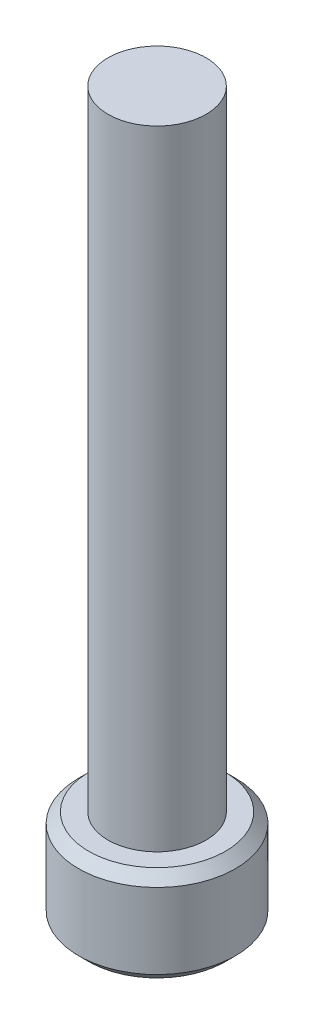
ISO-10303-21;
HEADER;
FILE_DESCRIPTION(('STEP AP214'),'2;1');
FILE_NAME('part.step','',(''),(''),'','','');
FILE_SCHEMA(('AUTOMOTIVE_DESIGN { 1 0 10303 214 1 1 1 1 }'));
ENDSEC;
DATA;
#1=APPLICATION_CONTEXT('core data for automotive mechanical design processes');
#2=APPLICATION_PROTOCOL_DEFINITION('international standard','automotive_design',2000,#1);
#3=PRODUCT_CONTEXT('',#1,'mechanical');
#4=PRODUCT('Part','Part','',(#3));
#5=PRODUCT_RELATED_PRODUCT_CATEGORY('part','',(#4));
#6=PRODUCT_DEFINITION_FORMATION('','',#4);
#7=PRODUCT_DEFINITION_CONTEXT('part definition',#1,'design');
#8=PRODUCT_DEFINITION('design','',#6,#7);
#9=PRODUCT_DEFINITION_SHAPE('','',#8);
#10=(LENGTH_UNIT() NAMED_UNIT(*) SI_UNIT(.MILLI.,.METRE.));
#11=(NAMED_UNIT(*) PLANE_ANGLE_UNIT() SI_UNIT($,.RADIAN.));
#12=(NAMED_UNIT(*) SI_UNIT($,.STERADIAN.) SOLID_ANGLE_UNIT());
#13=UNCERTAINTY_MEASURE_WITH_UNIT(LENGTH_MEASURE(1.E-05),#10,'distance_accuracy_value','');
#14=(GEOMETRIC_REPRESENTATION_CONTEXT(3) GLOBAL_UNCERTAINTY_ASSIGNED_CONTEXT((#13)) GLOBAL_UNIT_ASSIGNED_CONTEXT((#10,
#11,#12)) REPRESENTATION_CONTEXT('',''));
#15=CARTESIAN_POINT('',(0.,0.,0.));
#16=DIRECTION('',(0.,0.,1.));
#17=DIRECTION('',(1.,0.,0.));
#18=AXIS2_PLACEMENT_3D('',#15,#16,#17);
#19=CARTESIAN_POINT('',(0.,31.75,0.));
#20=DIRECTION('',(0.,-1.,0.));
#21=DIRECTION('',(0.,0.,-1.));
#22=AXIS2_PLACEMENT_3D('',#19,#20,#21);
#23=CYLINDRICAL_SURFACE('',#22,2.4765);
#24=CARTESIAN_POINT('',(0.,31.75,0.));
#25=DIRECTION('',(0.,1.,0.));
#26=DIRECTION('',(0.,0.,1.));
#27=AXIS2_PLACEMENT_3D('',#24,#25,#26);
#28=CIRCLE('',#27,2.4765);
#29=CARTESIAN_POINT('',(0.,31.75,2.4765));
#30=VERTEX_POINT('',#29);
#31=EDGE_CURVE('E150',#30,#30,#28,.T.);
#32=ORIENTED_EDGE('',*,*,#31,.F.);
#33=EDGE_LOOP('',(#32));
#34=FACE_BOUND('',#33,.T.);
#35=CARTESIAN_POINT('',(0.,0.,0.));
#36=DIRECTION('',(0.,1.,0.));
#37=DIRECTION('',(0.,0.,1.));
#38=AXIS2_PLACEMENT_3D('',#35,#36,#37);
#39=CIRCLE('',#38,2.4765);
#40=CARTESIAN_POINT('',(0.,0.,2.4765));
#41=VERTEX_POINT('',#40);
#42=EDGE_CURVE('E144',#41,#41,#39,.T.);
#43=ORIENTED_EDGE('',*,*,#42,.T.);
#44=EDGE_LOOP('',(#43));
#45=FACE_BOUND('',#44,.T.);
#46=ADVANCED_FACE('F41',(#34,#45),#23,.T.);
#47=CARTESIAN_POINT('',(0.,31.75,0.));
#48=DIRECTION('',(0.,1.,0.));
#49=DIRECTION('',(0.,0.,1.));
#50=AXIS2_PLACEMENT_3D('',#47,#48,#49);
#51=PLANE('',#50);
#52=ORIENTED_EDGE('',*,*,#31,.T.);
#53=EDGE_LOOP('',(#52));
#54=FACE_BOUND('',#53,.T.);
#55=ADVANCED_FACE('F175',(#54),#51,.T.);
#56=CARTESIAN_POINT('',(0.,-4.826,0.));
#57=DIRECTION('',(0.,1.,0.));
#58=DIRECTION('',(0.,0.,1.));
#59=AXIS2_PLACEMENT_3D('',#56,#57,#58);
#60=CYLINDRICAL_SURFACE('',#59,3.9624);
#61=CARTESIAN_POINT('',(0.,-0.507999999999996,0.));
#62=DIRECTION('',(0.,-1.,0.));
#63=DIRECTION('',(0.,0.,-1.));
#64=AXIS2_PLACEMENT_3D('',#61,#62,#63);
#65=CIRCLE('',#64,3.9624);
#66=CARTESIAN_POINT('',(0.,-0.507999999999996,-3.9624));
#67=VERTEX_POINT('',#66);
#68=EDGE_CURVE('E158',#67,#67,#65,.T.);
#69=ORIENTED_EDGE('',*,*,#68,.T.);
#70=EDGE_LOOP('',(#69));
#71=FACE_BOUND('',#70,.T.);
#72=CARTESIAN_POINT('',(0.,-4.318,0.));
#73=DIRECTION('',(0.,-1.,0.));
#74=DIRECTION('',(0.,0.,-1.));
#75=AXIS2_PLACEMENT_3D('',#72,#73,#74);
#76=CIRCLE('',#75,3.9624);
#77=CARTESIAN_POINT('',(0.,-4.318,-3.9624));
#78=VERTEX_POINT('',#77);
#79=EDGE_CURVE('E153',#78,#78,#76,.F.);
#80=ORIENTED_EDGE('',*,*,#79,.T.);
#81=EDGE_LOOP('',(#80));
#82=FACE_BOUND('',#81,.T.);
#83=ADVANCED_FACE('F171',(#71,#82),#60,.T.);
#84=CARTESIAN_POINT('',(0.,-4.826,0.));
#85=DIRECTION('',(0.,-1.,0.));
#86=DIRECTION('',(0.,0.,-1.));
#87=AXIS2_PLACEMENT_3D('',#84,#85,#86);
#88=PLANE('',#87);
#89=CARTESIAN_POINT('',(0.,-4.826,0.));
#90=DIRECTION('',(0.,-1.,0.));
#91=DIRECTION('',(0.,0.,-1.));
#92=AXIS2_PLACEMENT_3D('',#89,#90,#91);
#93=CIRCLE('',#92,3.4544);
#94=CARTESIAN_POINT('',(0.,-4.826,-3.4544));
#95=VERTEX_POINT('',#94);
#96=EDGE_CURVE('E11',#95,#95,#93,.T.);
#97=ORIENTED_EDGE('',*,*,#96,.T.);
#98=EDGE_LOOP('',(#97));
#99=FACE_BOUND('',#98,.T.);
#100=DIRECTION('',(0.5,0.,0.866025403784439));
#101=VECTOR('',#100,1.);
#102=CARTESIAN_POINT('',(1.14567944042316,-4.826,-1.984375));
#103=LINE('',#102,#101);
#104=CARTESIAN_POINT('',(1.14567944042316,-4.826,-1.984375));
#105=VERTEX_POINT('',#104);
#106=CARTESIAN_POINT('',(2.29135888084633,-4.826,0.));
#107=VERTEX_POINT('',#106);
#108=EDGE_CURVE('E57',#105,#107,#103,.T.);
#109=ORIENTED_EDGE('',*,*,#108,.F.);
#110=DIRECTION('',(1.,0.,0.));
#111=VECTOR('',#110,1.);
#112=CARTESIAN_POINT('',(-1.14567944042316,-4.826,-1.984375));
#113=LINE('',#112,#111);
#114=CARTESIAN_POINT('',(-1.14567944042316,-4.826,-1.984375));
#115=VERTEX_POINT('',#114);
#116=EDGE_CURVE('E140',#115,#105,#113,.T.);
#117=ORIENTED_EDGE('',*,*,#116,.F.);
#118=DIRECTION('',(0.5,0.,-0.866025403784439));
#119=VECTOR('',#118,1.);
#120=CARTESIAN_POINT('',(-2.29135888084633,-4.826,0.));
#121=LINE('',#120,#119);
#122=CARTESIAN_POINT('',(-2.29135888084633,-4.826,0.));
#123=VERTEX_POINT('',#122);
#124=EDGE_CURVE('E138',#123,#115,#121,.T.);
#125=ORIENTED_EDGE('',*,*,#124,.F.);
#126=DIRECTION('',(-0.5,0.,-0.866025403784439));
#127=VECTOR('',#126,1.);
#128=CARTESIAN_POINT('',(-1.14567944042316,-4.826,1.984375));
#129=LINE('',#128,#127);
#130=CARTESIAN_POINT('',(-1.14567944042316,-4.826,1.984375));
#131=VERTEX_POINT('',#130);
#132=EDGE_CURVE('E105',#131,#123,#129,.T.);
#133=ORIENTED_EDGE('',*,*,#132,.F.);
#134=DIRECTION('',(-1.,0.,0.));
#135=VECTOR('',#134,1.);
#136=CARTESIAN_POINT('',(1.14567944042316,-4.826,1.984375));
#137=LINE('',#136,#135);
#138=CARTESIAN_POINT('',(1.14567944042316,-4.826,1.984375));
#139=VERTEX_POINT('',#138);
#140=EDGE_CURVE('E134',#139,#131,#137,.T.);
#141=ORIENTED_EDGE('',*,*,#140,.F.);
#142=DIRECTION('',(-0.5,0.,0.866025403784439));
#143=VECTOR('',#142,1.);
#144=CARTESIAN_POINT('',(2.29135888084633,-4.826,0.));
#145=LINE('',#144,#143);
#146=EDGE_CURVE('E131',#107,#139,#145,.T.);
#147=ORIENTED_EDGE('',*,*,#146,.F.);
#148=EDGE_LOOP('',(#109,#117,#125,#133,#141,#147));
#149=FACE_BOUND('',#148,.T.);
#150=ADVANCED_FACE('F174',(#99,#149),#88,.T.);
#151=CARTESIAN_POINT('',(0.,0.,0.));
#152=DIRECTION('',(0.,-1.,0.));
#153=DIRECTION('',(0.,0.,-1.));
#154=AXIS2_PLACEMENT_3D('',#151,#152,#153);
#155=PLANE('',#154);
#156=CARTESIAN_POINT('',(0.,0.,0.));
#157=DIRECTION('',(0.,-1.,0.));
#158=DIRECTION('',(0.,0.,-1.));
#159=AXIS2_PLACEMENT_3D('',#156,#157,#158);
#160=CIRCLE('',#159,3.4544);
#161=CARTESIAN_POINT('',(0.,0.,-3.4544));
#162=VERTEX_POINT('',#161);
#163=EDGE_CURVE('E50',#162,#162,#160,.F.);
#164=ORIENTED_EDGE('',*,*,#163,.T.);
#165=EDGE_LOOP('',(#164));
#166=FACE_BOUND('',#165,.T.);
#167=ORIENTED_EDGE('',*,*,#42,.F.);
#168=EDGE_LOOP('',(#167));
#169=FACE_BOUND('',#168,.T.);
#170=ADVANCED_FACE('F163',(#166,#169),#155,.F.);
#171=CARTESIAN_POINT('',(1.14567944042316,-2.54,-1.984375));
#172=DIRECTION('',(0.866025403784439,0.,-0.5));
#173=DIRECTION('',(-0.5,0.,-0.866025403784439));
#174=AXIS2_PLACEMENT_3D('',#171,#172,#173);
#175=PLANE('',#174);
#176=ORIENTED_EDGE('',*,*,#108,.T.);
#177=DIRECTION('',(0.,-1.,0.));
#178=VECTOR('',#177,1.);
#179=CARTESIAN_POINT('',(2.29135888084633,-2.54,0.));
#180=LINE('',#179,#178);
#181=CARTESIAN_POINT('',(2.29135888084633,-2.54,0.));
#182=VERTEX_POINT('',#181);
#183=EDGE_CURVE('E87',#182,#107,#180,.T.);
#184=ORIENTED_EDGE('',*,*,#183,.F.);
#185=DIRECTION('',(0.5,0.,0.866025403784439));
#186=VECTOR('',#185,1.);
#187=CARTESIAN_POINT('',(1.14567944042316,-2.54,-1.984375));
#188=LINE('',#187,#186);
#189=CARTESIAN_POINT('',(1.14567944042316,-2.54,-1.984375));
#190=VERTEX_POINT('',#189);
#191=EDGE_CURVE('E142',#190,#182,#188,.T.);
#192=ORIENTED_EDGE('',*,*,#191,.F.);
#193=DIRECTION('',(0.,-1.,0.));
#194=VECTOR('',#193,1.);
#195=CARTESIAN_POINT('',(1.14567944042316,-2.54,-1.984375));
#196=LINE('',#195,#194);
#197=EDGE_CURVE('E65',#190,#105,#196,.T.);
#198=ORIENTED_EDGE('',*,*,#197,.T.);
#199=EDGE_LOOP('',(#176,#184,#192,#198));
#200=FACE_BOUND('',#199,.T.);
#201=ADVANCED_FACE('F192',(#200),#175,.F.);
#202=CARTESIAN_POINT('',(-1.14567944042316,-2.54,-1.984375));
#203=DIRECTION('',(0.,0.,-1.));
#204=DIRECTION('',(-1.,0.,0.));
#205=AXIS2_PLACEMENT_3D('',#202,#203,#204);
#206=PLANE('',#205);
#207=ORIENTED_EDGE('',*,*,#116,.T.);
#208=ORIENTED_EDGE('',*,*,#197,.F.);
#209=DIRECTION('',(1.,0.,0.));
#210=VECTOR('',#209,1.);
#211=CARTESIAN_POINT('',(-1.14567944042316,-2.54,-1.984375));
#212=LINE('',#211,#210);
#213=CARTESIAN_POINT('',(-1.14567944042316,-2.54,-1.984375));
#214=VERTEX_POINT('',#213);
#215=EDGE_CURVE('E117',#214,#190,#212,.T.);
#216=ORIENTED_EDGE('',*,*,#215,.F.);
#217=DIRECTION('',(0.,-1.,0.));
#218=VECTOR('',#217,1.);
#219=CARTESIAN_POINT('',(-1.14567944042316,-2.54,-1.984375));
#220=LINE('',#219,#218);
#221=EDGE_CURVE('E109',#214,#115,#220,.T.);
#222=ORIENTED_EDGE('',*,*,#221,.T.);
#223=EDGE_LOOP('',(#207,#208,#216,#222));
#224=FACE_BOUND('',#223,.T.);
#225=ADVANCED_FACE('F194',(#224),#206,.F.);
#226=CARTESIAN_POINT('',(-2.29135888084633,-2.54,0.));
#227=DIRECTION('',(-0.866025403784439,0.,-0.5));
#228=DIRECTION('',(-0.5,0.,0.866025403784439));
#229=AXIS2_PLACEMENT_3D('',#226,#227,#228);
#230=PLANE('',#229);
#231=ORIENTED_EDGE('',*,*,#124,.T.);
#232=ORIENTED_EDGE('',*,*,#221,.F.);
#233=DIRECTION('',(0.5,0.,-0.866025403784439));
#234=VECTOR('',#233,1.);
#235=CARTESIAN_POINT('',(-2.29135888084633,-2.54,0.));
#236=LINE('',#235,#234);
#237=CARTESIAN_POINT('',(-2.29135888084633,-2.54,0.));
#238=VERTEX_POINT('',#237);
#239=EDGE_CURVE('E113',#238,#214,#236,.T.);
#240=ORIENTED_EDGE('',*,*,#239,.F.);
#241=DIRECTION('',(0.,-1.,0.));
#242=VECTOR('',#241,1.);
#243=CARTESIAN_POINT('',(-2.29135888084633,-2.54,0.));
#244=LINE('',#243,#242);
#245=EDGE_CURVE('E98',#238,#123,#244,.T.);
#246=ORIENTED_EDGE('',*,*,#245,.T.);
#247=EDGE_LOOP('',(#231,#232,#240,#246));
#248=FACE_BOUND('',#247,.T.);
#249=ADVANCED_FACE('F114',(#248),#230,.F.);
#250=CARTESIAN_POINT('',(-1.14567944042316,-2.54,1.984375));
#251=DIRECTION('',(-0.866025403784439,0.,0.5));
#252=DIRECTION('',(0.5,0.,0.866025403784439));
#253=AXIS2_PLACEMENT_3D('',#250,#251,#252);
#254=PLANE('',#253);
#255=ORIENTED_EDGE('',*,*,#132,.T.);
#256=ORIENTED_EDGE('',*,*,#245,.F.);
#257=DIRECTION('',(-0.5,0.,-0.866025403784439));
#258=VECTOR('',#257,1.);
#259=CARTESIAN_POINT('',(-1.14567944042316,-2.54,1.984375));
#260=LINE('',#259,#258);
#261=CARTESIAN_POINT('',(-1.14567944042316,-2.54,1.984375));
#262=VERTEX_POINT('',#261);
#263=EDGE_CURVE('E102',#262,#238,#260,.T.);
#264=ORIENTED_EDGE('',*,*,#263,.F.);
#265=DIRECTION('',(0.,-1.,0.));
#266=VECTOR('',#265,1.);
#267=CARTESIAN_POINT('',(-1.14567944042316,-2.54,1.984375));
#268=LINE('',#267,#266);
#269=EDGE_CURVE('E110',#262,#131,#268,.T.);
#270=ORIENTED_EDGE('',*,*,#269,.T.);
#271=EDGE_LOOP('',(#255,#256,#264,#270));
#272=FACE_BOUND('',#271,.T.);
#273=ADVANCED_FACE('F100',(#272),#254,.F.);
#274=CARTESIAN_POINT('',(1.14567944042316,-2.54,1.984375));
#275=DIRECTION('',(0.,0.,1.));
#276=DIRECTION('',(1.,0.,0.));
#277=AXIS2_PLACEMENT_3D('',#274,#275,#276);
#278=PLANE('',#277);
#279=ORIENTED_EDGE('',*,*,#140,.T.);
#280=ORIENTED_EDGE('',*,*,#269,.F.);
#281=DIRECTION('',(-1.,0.,0.));
#282=VECTOR('',#281,1.);
#283=CARTESIAN_POINT('',(1.14567944042316,-2.54,1.984375));
#284=LINE('',#283,#282);
#285=CARTESIAN_POINT('',(1.14567944042316,-2.54,1.984375));
#286=VERTEX_POINT('',#285);
#287=EDGE_CURVE('E123',#286,#262,#284,.T.);
#288=ORIENTED_EDGE('',*,*,#287,.F.);
#289=DIRECTION('',(0.,-1.,0.));
#290=VECTOR('',#289,1.);
#291=CARTESIAN_POINT('',(1.14567944042316,-2.54,1.984375));
#292=LINE('',#291,#290);
#293=EDGE_CURVE('E147',#286,#139,#292,.T.);
#294=ORIENTED_EDGE('',*,*,#293,.T.);
#295=EDGE_LOOP('',(#279,#280,#288,#294));
#296=FACE_BOUND('',#295,.T.);
#297=ADVANCED_FACE('F271',(#296),#278,.F.);
#298=CARTESIAN_POINT('',(2.29135888084633,-2.54,0.));
#299=DIRECTION('',(0.866025403784439,0.,0.5));
#300=DIRECTION('',(0.5,0.,-0.866025403784439));
#301=AXIS2_PLACEMENT_3D('',#298,#299,#300);
#302=PLANE('',#301);
#303=ORIENTED_EDGE('',*,*,#146,.T.);
#304=ORIENTED_EDGE('',*,*,#293,.F.);
#305=DIRECTION('',(-0.5,0.,0.866025403784439));
#306=VECTOR('',#305,1.);
#307=CARTESIAN_POINT('',(2.29135888084633,-2.54,0.));
#308=LINE('',#307,#306);
#309=EDGE_CURVE('E125',#182,#286,#308,.T.);
#310=ORIENTED_EDGE('',*,*,#309,.F.);
#311=ORIENTED_EDGE('',*,*,#183,.T.);
#312=EDGE_LOOP('',(#303,#304,#310,#311));
#313=FACE_BOUND('',#312,.T.);
#314=ADVANCED_FACE('F190',(#313),#302,.F.);
#315=CARTESIAN_POINT('',(0.,-2.54,0.));
#316=DIRECTION('',(0.,-1.,0.));
#317=DIRECTION('',(0.,0.,-1.));
#318=AXIS2_PLACEMENT_3D('',#315,#316,#317);
#319=PLANE('',#318);
#320=ORIENTED_EDGE('',*,*,#191,.T.);
#321=ORIENTED_EDGE('',*,*,#309,.T.);
#322=ORIENTED_EDGE('',*,*,#287,.T.);
#323=ORIENTED_EDGE('',*,*,#263,.T.);
#324=ORIENTED_EDGE('',*,*,#239,.T.);
#325=ORIENTED_EDGE('',*,*,#215,.T.);
#326=EDGE_LOOP('',(#320,#321,#322,#323,#324,#325));
#327=FACE_BOUND('',#326,.T.);
#328=ADVANCED_FACE('F120',(#327),#319,.T.);
#329=CARTESIAN_POINT('',(0.,-0.507999999999996,0.));
#330=DIRECTION('',(0.,-1.,0.));
#331=DIRECTION('',(0.,0.,-1.));
#332=AXIS2_PLACEMENT_3D('',#329,#330,#331);
#333=CONICAL_SURFACE('',#332,3.9624,0.785398163397448);
#334=ORIENTED_EDGE('',*,*,#163,.F.);
#335=EDGE_LOOP('',(#334));
#336=FACE_BOUND('',#335,.T.);
#337=ORIENTED_EDGE('',*,*,#68,.F.);
#338=EDGE_LOOP('',(#337));
#339=FACE_BOUND('',#338,.T.);
#340=ADVANCED_FACE('F166',(#336,#339),#333,.T.);
#341=CARTESIAN_POINT('',(0.,-4.826,0.));
#342=DIRECTION('',(0.,1.,0.));
#343=DIRECTION('',(0.,0.,1.));
#344=AXIS2_PLACEMENT_3D('',#341,#342,#343);
#345=CONICAL_SURFACE('',#344,3.4544,0.785398163397445);
#346=ORIENTED_EDGE('',*,*,#79,.F.);
#347=EDGE_LOOP('',(#346));
#348=FACE_BOUND('',#347,.T.);
#349=ORIENTED_EDGE('',*,*,#96,.F.);
#350=EDGE_LOOP('',(#349));
#351=FACE_BOUND('',#350,.T.);
#352=ADVANCED_FACE('F44',(#348,#351),#345,.T.);
#353=CLOSED_SHELL('',(#46,#55,#83,#150,#170,#201,#225,#249,#273,#297,#314,#328,#340,#352));
#354=MANIFOLD_SOLID_BREP('B2',#353);
#355=ADVANCED_BREP_SHAPE_REPRESENTATION('',(#18,#354),#14);
#356=SHAPE_DEFINITION_REPRESENTATION(#9,#355);
ENDSEC;
END-ISO-10303-21;
